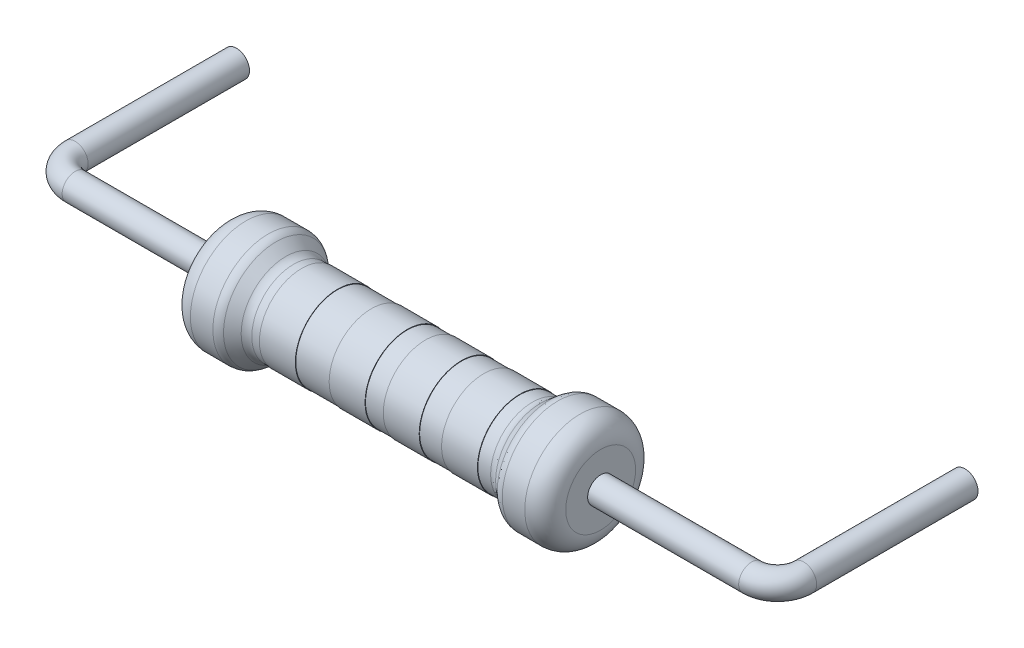
ISO-10303-21;
HEADER;
FILE_DESCRIPTION(('STEP AP214'),'2;1');
FILE_NAME('part.step','',(''),(''),'','','');
FILE_SCHEMA(('AUTOMOTIVE_DESIGN { 1 0 10303 214 1 1 1 1 }'));
ENDSEC;
DATA;
#1=APPLICATION_CONTEXT('core data for automotive mechanical design processes');
#2=APPLICATION_PROTOCOL_DEFINITION('international standard','automotive_design',2000,#1);
#3=PRODUCT_CONTEXT('',#1,'mechanical');
#4=PRODUCT('Part','Part','',(#3));
#5=PRODUCT_RELATED_PRODUCT_CATEGORY('part','',(#4));
#6=PRODUCT_DEFINITION_FORMATION('','',#4);
#7=PRODUCT_DEFINITION_CONTEXT('part definition',#1,'design');
#8=PRODUCT_DEFINITION('design','',#6,#7);
#9=PRODUCT_DEFINITION_SHAPE('','',#8);
#10=(LENGTH_UNIT() NAMED_UNIT(*) SI_UNIT(.MILLI.,.METRE.));
#11=(NAMED_UNIT(*) PLANE_ANGLE_UNIT() SI_UNIT($,.RADIAN.));
#12=(NAMED_UNIT(*) SI_UNIT($,.STERADIAN.) SOLID_ANGLE_UNIT());
#13=UNCERTAINTY_MEASURE_WITH_UNIT(LENGTH_MEASURE(1.E-05),#10,'distance_accuracy_value','');
#14=(GEOMETRIC_REPRESENTATION_CONTEXT(3) GLOBAL_UNCERTAINTY_ASSIGNED_CONTEXT((#13)) GLOBAL_UNIT_ASSIGNED_CONTEXT((#10,
#11,#12)) REPRESENTATION_CONTEXT('',''));
#15=CARTESIAN_POINT('',(0.,0.,0.));
#16=DIRECTION('',(0.,0.,1.));
#17=DIRECTION('',(1.,0.,0.));
#18=AXIS2_PLACEMENT_3D('',#15,#16,#17);
#19=CARTESIAN_POINT('',(9.71070660743841,33.0962,0.7747));
#20=DIRECTION('',(0.,1.,0.));
#21=DIRECTION('',(0.,0.,1.));
#22=AXIS2_PLACEMENT_3D('',#19,#20,#21);
#23=TOROIDAL_SURFACE('',#22,0.635,0.3175);
#24=CARTESIAN_POINT('',(9.07570660743841,33.0962,0.7747));
#25=DIRECTION('',(0.,0.,-1.));
#26=DIRECTION('',(-1.,0.,0.));
#27=AXIS2_PLACEMENT_3D('',#24,#25,#26);
#28=CIRCLE('',#27,0.3175);
#29=CARTESIAN_POINT('',(9.39320660743841,33.0962,0.7747));
#30=VERTEX_POINT('',#29);
#31=EDGE_CURVE('E40',#30,#30,#28,.T.);
#32=ORIENTED_EDGE('',*,*,#31,.F.);
#33=EDGE_LOOP('',(#32));
#34=FACE_BOUND('',#33,.T.);
#35=CARTESIAN_POINT('',(9.71070660743841,33.0962,1.4097));
#36=DIRECTION('',(-1.,0.,0.));
#37=DIRECTION('',(0.,0.,1.));
#38=AXIS2_PLACEMENT_3D('',#35,#36,#37);
#39=CIRCLE('',#38,0.3175);
#40=CARTESIAN_POINT('',(9.71070660743841,33.0962,1.0922));
#41=VERTEX_POINT('',#40);
#42=EDGE_CURVE('E11',#41,#41,#39,.T.);
#43=ORIENTED_EDGE('',*,*,#42,.T.);
#44=EDGE_LOOP('',(#43));
#45=FACE_BOUND('',#44,.T.);
#46=ADVANCED_FACE('F16',(#34,#45),#23,.T.);
#47=CARTESIAN_POINT('',(26.2207066074384,33.0962,0.7747));
#48=DIRECTION('',(0.,-1.,0.));
#49=DIRECTION('',(0.,0.,-1.));
#50=AXIS2_PLACEMENT_3D('',#47,#48,#49);
#51=TOROIDAL_SURFACE('',#50,0.635,0.3175);
#52=CARTESIAN_POINT('',(26.8557066074384,33.0962,0.7747));
#53=DIRECTION('',(0.,0.,-1.));
#54=DIRECTION('',(-1.,0.,0.));
#55=AXIS2_PLACEMENT_3D('',#52,#53,#54);
#56=CIRCLE('',#55,0.3175);
#57=CARTESIAN_POINT('',(26.5382066074384,33.0962,0.7747));
#58=VERTEX_POINT('',#57);
#59=EDGE_CURVE('E208',#58,#58,#56,.T.);
#60=ORIENTED_EDGE('',*,*,#59,.F.);
#61=EDGE_LOOP('',(#60));
#62=FACE_BOUND('',#61,.T.);
#63=CARTESIAN_POINT('',(26.2207066074384,33.0962,1.4097));
#64=DIRECTION('',(1.,0.,0.));
#65=DIRECTION('',(0.,0.,-1.));
#66=AXIS2_PLACEMENT_3D('',#63,#64,#65);
#67=CIRCLE('',#66,0.3175);
#68=CARTESIAN_POINT('',(26.2207066074384,33.0962,1.0922));
#69=VERTEX_POINT('',#68);
#70=EDGE_CURVE('E27',#69,#69,#67,.T.);
#71=ORIENTED_EDGE('',*,*,#70,.T.);
#72=EDGE_LOOP('',(#71));
#73=FACE_BOUND('',#72,.T.);
#74=ADVANCED_FACE('F265',(#62,#73),#51,.T.);
#75=CARTESIAN_POINT('',(26.8557066074384,33.0962,0.0127000000000011));
#76=DIRECTION('',(0.,0.,-1.));
#77=DIRECTION('',(-1.,0.,0.));
#78=AXIS2_PLACEMENT_3D('',#75,#76,#77);
#79=CYLINDRICAL_SURFACE('',#78,0.3175);
#80=ORIENTED_EDGE('',*,*,#59,.T.);
#81=EDGE_LOOP('',(#80));
#82=FACE_BOUND('',#81,.T.);
#83=CARTESIAN_POINT('',(26.8557066074384,33.0962,-3.1623));
#84=DIRECTION('',(0.,0.,1.));
#85=DIRECTION('',(-1.,0.,0.));
#86=AXIS2_PLACEMENT_3D('',#83,#84,#85);
#87=CIRCLE('',#86,0.3175);
#88=CARTESIAN_POINT('',(26.5382066074384,33.0962,-3.1623));
#89=VERTEX_POINT('',#88);
#90=EDGE_CURVE('E212',#89,#89,#87,.T.);
#91=ORIENTED_EDGE('',*,*,#90,.T.);
#92=EDGE_LOOP('',(#91));
#93=FACE_BOUND('',#92,.T.);
#94=ADVANCED_FACE('F271',(#82,#93),#79,.T.);
#95=CARTESIAN_POINT('',(9.07570660743841,33.0962,0.0127000000000011));
#96=DIRECTION('',(0.,0.,-1.));
#97=DIRECTION('',(-1.,0.,0.));
#98=AXIS2_PLACEMENT_3D('',#95,#96,#97);
#99=CYLINDRICAL_SURFACE('',#98,0.3175);
#100=ORIENTED_EDGE('',*,*,#31,.T.);
#101=EDGE_LOOP('',(#100));
#102=FACE_BOUND('',#101,.T.);
#103=CARTESIAN_POINT('',(9.07570660743841,33.0962,-3.1623));
#104=DIRECTION('',(0.,0.,1.));
#105=DIRECTION('',(-1.,0.,0.));
#106=AXIS2_PLACEMENT_3D('',#103,#104,#105);
#107=CIRCLE('',#106,0.3175);
#108=CARTESIAN_POINT('',(8.75820660743841,33.0962,-3.1623));
#109=VERTEX_POINT('',#108);
#110=EDGE_CURVE('E199',#109,#109,#107,.T.);
#111=ORIENTED_EDGE('',*,*,#110,.T.);
#112=EDGE_LOOP('',(#111));
#113=FACE_BOUND('',#112,.T.);
#114=ADVANCED_FACE('F300',(#102,#113),#99,.T.);
#115=CARTESIAN_POINT('',(13.8757066074384,33.0962,1.4097));
#116=DIRECTION('',(-1.,0.,0.));
#117=DIRECTION('',(0.,0.,1.));
#118=AXIS2_PLACEMENT_3D('',#115,#116,#117);
#119=TOROIDAL_SURFACE('',#118,0.85255,0.5);
#120=CARTESIAN_POINT('',(13.8757066074384,33.0962,1.4097));
#121=DIRECTION('',(-1.,0.,0.));
#122=DIRECTION('',(0.,0.,1.));
#123=AXIS2_PLACEMENT_3D('',#120,#121,#122);
#124=CIRCLE('',#123,1.35255);
#125=CARTESIAN_POINT('',(13.8757066074384,33.0962,0.0571500000000012));
#126=VERTEX_POINT('',#125);
#127=EDGE_CURVE('E203',#126,#126,#124,.T.);
#128=ORIENTED_EDGE('',*,*,#127,.T.);
#129=EDGE_LOOP('',(#128));
#130=FACE_BOUND('',#129,.T.);
#131=CARTESIAN_POINT('',(13.3757066074384,33.0962,1.4097));
#132=DIRECTION('',(-1.,0.,0.));
#133=DIRECTION('',(0.,0.,1.));
#134=AXIS2_PLACEMENT_3D('',#131,#132,#133);
#135=CIRCLE('',#134,0.85255);
#136=CARTESIAN_POINT('',(13.3757066074384,33.0962,2.26225));
#137=VERTEX_POINT('',#136);
#138=EDGE_CURVE('E162',#137,#137,#135,.T.);
#139=ORIENTED_EDGE('',*,*,#138,.F.);
#140=EDGE_LOOP('',(#139));
#141=FACE_BOUND('',#140,.T.);
#142=ADVANCED_FACE('F348',(#130,#141),#119,.T.);
#143=CARTESIAN_POINT('',(14.1497983015064,33.0962,1.4097));
#144=DIRECTION('',(-1.,0.,0.));
#145=DIRECTION('',(0.,0.,1.));
#146=AXIS2_PLACEMENT_3D('',#143,#144,#145);
#147=CYLINDRICAL_SURFACE('',#146,1.35255);
#148=CARTESIAN_POINT('',(14.4238899955734,33.0962,1.4097));
#149=DIRECTION('',(-1.,0.,0.));
#150=DIRECTION('',(0.,0.,1.));
#151=AXIS2_PLACEMENT_3D('',#148,#149,#150);
#152=CIRCLE('',#151,1.35255);
#153=CARTESIAN_POINT('',(14.4238899955734,33.0962,0.0571500000000011));
#154=VERTEX_POINT('',#153);
#155=EDGE_CURVE('E171',#154,#154,#152,.T.);
#156=ORIENTED_EDGE('',*,*,#155,.T.);
#157=EDGE_LOOP('',(#156));
#158=FACE_BOUND('',#157,.T.);
#159=ORIENTED_EDGE('',*,*,#127,.F.);
#160=EDGE_LOOP('',(#159));
#161=FACE_BOUND('',#160,.T.);
#162=ADVANCED_FACE('F276',(#158,#161),#147,.T.);
#163=CARTESIAN_POINT('',(14.4238899955734,33.0962,1.4097));
#164=DIRECTION('',(-1.,0.,0.));
#165=DIRECTION('',(0.,0.,1.));
#166=AXIS2_PLACEMENT_3D('',#163,#164,#165);
#167=TOROIDAL_SURFACE('',#166,1.05255,0.3);
#168=CARTESIAN_POINT('',(14.6152283747944,33.0962,1.4097));
#169=DIRECTION('',(-1.,0.,0.));
#170=DIRECTION('',(0.,0.,1.));
#171=AXIS2_PLACEMENT_3D('',#168,#169,#170);
#172=CIRCLE('',#171,1.283611949782);
#173=CARTESIAN_POINT('',(14.6152283747944,33.0962,0.12608805037443));
#174=VERTEX_POINT('',#173);
#175=EDGE_CURVE('E167',#174,#174,#172,.T.);
#176=ORIENTED_EDGE('',*,*,#175,.T.);
#177=EDGE_LOOP('',(#176));
#178=FACE_BOUND('',#177,.T.);
#179=ORIENTED_EDGE('',*,*,#155,.F.);
#180=EDGE_LOOP('',(#179));
#181=FACE_BOUND('',#180,.T.);
#182=ADVANCED_FACE('F302',(#178,#181),#167,.T.);
#183=CARTESIAN_POINT('',(14.7328640249674,33.0962,1.4097));
#184=DIRECTION('',(-1.,0.,0.));
#185=DIRECTION('',(0.,0.,1.));
#186=AXIS2_PLACEMENT_3D('',#183,#184,#185);
#187=CONICAL_SURFACE('',#186,1.1861999152,0.691631466793246);
#188=CARTESIAN_POINT('',(14.8504996751404,33.0962,1.4097));
#189=DIRECTION('',(-1.,0.,0.));
#190=DIRECTION('',(0.,0.,1.));
#191=AXIS2_PLACEMENT_3D('',#188,#189,#190);
#192=CIRCLE('',#191,1.088787880619);
#193=CARTESIAN_POINT('',(14.8504996751404,33.0962,0.320912119381024));
#194=VERTEX_POINT('',#193);
#195=EDGE_CURVE('E172',#194,#194,#192,.T.);
#196=ORIENTED_EDGE('',*,*,#195,.T.);
#197=EDGE_LOOP('',(#196));
#198=FACE_BOUND('',#197,.T.);
#199=ORIENTED_EDGE('',*,*,#175,.F.);
#200=EDGE_LOOP('',(#199));
#201=FACE_BOUND('',#200,.T.);
#202=ADVANCED_FACE('F305',(#198,#201),#187,.T.);
#203=CARTESIAN_POINT('',(15.0418380543614,33.0962,1.4097));
#204=DIRECTION('',(-1.,0.,0.));
#205=DIRECTION('',(0.,0.,1.));
#206=AXIS2_PLACEMENT_3D('',#203,#204,#205);
#207=TOROIDAL_SURFACE('',#206,1.319849830401,0.3);
#208=ORIENTED_EDGE('',*,*,#195,.F.);
#209=EDGE_LOOP('',(#208));
#210=FACE_BOUND('',#209,.T.);
#211=CARTESIAN_POINT('',(15.0418380543614,33.0962,1.4097));
#212=DIRECTION('',(-1.,0.,0.));
#213=DIRECTION('',(0.,0.,1.));
#214=AXIS2_PLACEMENT_3D('',#211,#212,#213);
#215=CIRCLE('',#214,1.019849830401);
#216=CARTESIAN_POINT('',(15.0418380543614,33.0962,2.429549830401));
#217=VERTEX_POINT('',#216);
#218=EDGE_CURVE('E225',#217,#217,#215,.T.);
#219=ORIENTED_EDGE('',*,*,#218,.T.);
#220=EDGE_LOOP('',(#219));
#221=FACE_BOUND('',#220,.T.);
#222=ADVANCED_FACE('F342',(#210,#221),#207,.F.);
#223=CARTESIAN_POINT('',(17.9557066074384,33.0962,1.4097));
#224=DIRECTION('',(-1.,0.,0.));
#225=DIRECTION('',(0.,0.,1.));
#226=AXIS2_PLACEMENT_3D('',#223,#224,#225);
#227=CYLINDRICAL_SURFACE('',#226,1.019849830401);
#228=CARTESIAN_POINT('',(15.2382627119724,33.0962,1.4097));
#229=DIRECTION('',(-1.,0.,0.));
#230=DIRECTION('',(0.,0.,1.));
#231=AXIS2_PLACEMENT_3D('',#228,#229,#230);
#232=CIRCLE('',#231,1.019849830401);
#233=CARTESIAN_POINT('',(15.2382627119724,33.0962,0.389850169599001));
#234=VERTEX_POINT('',#233);
#235=EDGE_CURVE('E192',#234,#234,#232,.T.);
#236=ORIENTED_EDGE('',*,*,#235,.T.);
#237=EDGE_LOOP('',(#236));
#238=FACE_BOUND('',#237,.T.);
#239=ORIENTED_EDGE('',*,*,#218,.F.);
#240=EDGE_LOOP('',(#239));
#241=FACE_BOUND('',#240,.T.);
#242=ADVANCED_FACE('F323',(#238,#241),#227,.T.);
#243=CARTESIAN_POINT('',(20.8695751605154,33.0962,1.4097));
#244=DIRECTION('',(-1.,0.,0.));
#245=DIRECTION('',(0.,0.,1.));
#246=AXIS2_PLACEMENT_3D('',#243,#244,#245);
#247=TOROIDAL_SURFACE('',#246,1.319849830401,0.3);
#248=CARTESIAN_POINT('',(20.8695751605154,33.0962,1.4097));
#249=DIRECTION('',(-1.,0.,0.));
#250=DIRECTION('',(0.,0.,1.));
#251=AXIS2_PLACEMENT_3D('',#248,#249,#250);
#252=CIRCLE('',#251,1.019849830401);
#253=CARTESIAN_POINT('',(20.8695751605154,33.0962,2.429549830401));
#254=VERTEX_POINT('',#253);
#255=EDGE_CURVE('E187',#254,#254,#252,.T.);
#256=ORIENTED_EDGE('',*,*,#255,.F.);
#257=EDGE_LOOP('',(#256));
#258=FACE_BOUND('',#257,.T.);
#259=CARTESIAN_POINT('',(21.0609135397364,33.0962,1.4097));
#260=DIRECTION('',(-1.,0.,0.));
#261=DIRECTION('',(0.,0.,1.));
#262=AXIS2_PLACEMENT_3D('',#259,#260,#261);
#263=CIRCLE('',#262,1.088787880619);
#264=CARTESIAN_POINT('',(21.0609135397364,33.0962,2.498487880619));
#265=VERTEX_POINT('',#264);
#266=EDGE_CURVE('E188',#265,#265,#263,.T.);
#267=ORIENTED_EDGE('',*,*,#266,.T.);
#268=EDGE_LOOP('',(#267));
#269=FACE_BOUND('',#268,.T.);
#270=ADVANCED_FACE('F319',(#258,#269),#247,.F.);
#271=CARTESIAN_POINT('',(21.1785491899094,33.0962,1.4097));
#272=DIRECTION('',(1.,0.,0.));
#273=DIRECTION('',(0.,0.,1.));
#274=AXIS2_PLACEMENT_3D('',#271,#272,#273);
#275=CONICAL_SURFACE('',#274,1.1861999152,0.691631466793246);
#276=ORIENTED_EDGE('',*,*,#266,.F.);
#277=EDGE_LOOP('',(#276));
#278=FACE_BOUND('',#277,.T.);
#279=CARTESIAN_POINT('',(21.2961848400824,33.0962,1.4097));
#280=DIRECTION('',(-1.,0.,0.));
#281=DIRECTION('',(0.,0.,1.));
#282=AXIS2_PLACEMENT_3D('',#279,#280,#281);
#283=CIRCLE('',#282,1.283611949782);
#284=CARTESIAN_POINT('',(21.2961848400824,33.0962,2.693311949782));
#285=VERTEX_POINT('',#284);
#286=EDGE_CURVE('E193',#285,#285,#283,.T.);
#287=ORIENTED_EDGE('',*,*,#286,.T.);
#288=EDGE_LOOP('',(#287));
#289=FACE_BOUND('',#288,.T.);
#290=ADVANCED_FACE('F322',(#278,#289),#275,.T.);
#291=CARTESIAN_POINT('',(21.4875232193034,33.0962,1.4097));
#292=DIRECTION('',(-1.,0.,0.));
#293=DIRECTION('',(0.,0.,1.));
#294=AXIS2_PLACEMENT_3D('',#291,#292,#293);
#295=TOROIDAL_SURFACE('',#294,1.05255,0.3);
#296=CARTESIAN_POINT('',(21.4875232193034,33.0962,1.4097));
#297=DIRECTION('',(-1.,0.,0.));
#298=DIRECTION('',(0.,0.,1.));
#299=AXIS2_PLACEMENT_3D('',#296,#297,#298);
#300=CIRCLE('',#299,1.35255);
#301=CARTESIAN_POINT('',(21.4875232193034,33.0962,0.0571500000000012));
#302=VERTEX_POINT('',#301);
#303=EDGE_CURVE('E177',#302,#302,#300,.T.);
#304=ORIENTED_EDGE('',*,*,#303,.T.);
#305=EDGE_LOOP('',(#304));
#306=FACE_BOUND('',#305,.T.);
#307=ORIENTED_EDGE('',*,*,#286,.F.);
#308=EDGE_LOOP('',(#307));
#309=FACE_BOUND('',#308,.T.);
#310=ADVANCED_FACE('F311',(#306,#309),#295,.T.);
#311=CARTESIAN_POINT('',(21.7616149133704,33.0962,1.4097));
#312=DIRECTION('',(-1.,0.,0.));
#313=DIRECTION('',(0.,0.,1.));
#314=AXIS2_PLACEMENT_3D('',#311,#312,#313);
#315=CYLINDRICAL_SURFACE('',#314,1.35255);
#316=CARTESIAN_POINT('',(22.0357066074384,33.0962,1.4097));
#317=DIRECTION('',(-1.,0.,0.));
#318=DIRECTION('',(0.,0.,1.));
#319=AXIS2_PLACEMENT_3D('',#316,#317,#318);
#320=CIRCLE('',#319,1.35255);
#321=CARTESIAN_POINT('',(22.0357066074384,33.0962,0.0571500000000011));
#322=VERTEX_POINT('',#321);
#323=EDGE_CURVE('E173',#322,#322,#320,.T.);
#324=ORIENTED_EDGE('',*,*,#323,.T.);
#325=EDGE_LOOP('',(#324));
#326=FACE_BOUND('',#325,.T.);
#327=ORIENTED_EDGE('',*,*,#303,.F.);
#328=EDGE_LOOP('',(#327));
#329=FACE_BOUND('',#328,.T.);
#330=ADVANCED_FACE('F307',(#326,#329),#315,.T.);
#331=CARTESIAN_POINT('',(22.0357066074384,33.0962,1.4097));
#332=DIRECTION('',(-1.,0.,0.));
#333=DIRECTION('',(0.,0.,1.));
#334=AXIS2_PLACEMENT_3D('',#331,#332,#333);
#335=TOROIDAL_SURFACE('',#334,0.85255,0.5);
#336=CARTESIAN_POINT('',(22.5357066074384,33.0962,1.4097));
#337=DIRECTION('',(-1.,0.,0.));
#338=DIRECTION('',(0.,0.,1.));
#339=AXIS2_PLACEMENT_3D('',#336,#337,#338);
#340=CIRCLE('',#339,0.85255);
#341=CARTESIAN_POINT('',(22.5357066074384,33.0962,0.55715));
#342=VERTEX_POINT('',#341);
#343=EDGE_CURVE('E178',#342,#342,#340,.T.);
#344=ORIENTED_EDGE('',*,*,#343,.T.);
#345=EDGE_LOOP('',(#344));
#346=FACE_BOUND('',#345,.T.);
#347=ORIENTED_EDGE('',*,*,#323,.F.);
#348=EDGE_LOOP('',(#347));
#349=FACE_BOUND('',#348,.T.);
#350=ADVANCED_FACE('F310',(#346,#349),#335,.T.);
#351=CARTESIAN_POINT('',(9.71070660743841,33.0962,1.4097));
#352=DIRECTION('',(1.,0.,0.));
#353=DIRECTION('',(0.,0.,1.));
#354=AXIS2_PLACEMENT_3D('',#351,#352,#353);
#355=CYLINDRICAL_SURFACE('',#354,0.3175);
#356=ORIENTED_EDGE('',*,*,#42,.F.);
#357=EDGE_LOOP('',(#356));
#358=FACE_BOUND('',#357,.T.);
#359=CARTESIAN_POINT('',(13.3757066074384,33.0962,1.4097));
#360=DIRECTION('',(1.,0.,0.));
#361=DIRECTION('',(0.,0.,1.));
#362=AXIS2_PLACEMENT_3D('',#359,#360,#361);
#363=CIRCLE('',#362,0.3175);
#364=CARTESIAN_POINT('',(13.3757066074384,33.0962,1.7272));
#365=VERTEX_POINT('',#364);
#366=EDGE_CURVE('E226',#365,#365,#363,.T.);
#367=ORIENTED_EDGE('',*,*,#366,.F.);
#368=EDGE_LOOP('',(#367));
#369=FACE_BOUND('',#368,.T.);
#370=ADVANCED_FACE('F329',(#358,#369),#355,.T.);
#371=CARTESIAN_POINT('',(26.2207066074384,33.0962,1.4097));
#372=DIRECTION('',(-1.,0.,0.));
#373=DIRECTION('',(0.,0.,-1.));
#374=AXIS2_PLACEMENT_3D('',#371,#372,#373);
#375=CYLINDRICAL_SURFACE('',#374,0.3175);
#376=ORIENTED_EDGE('',*,*,#70,.F.);
#377=EDGE_LOOP('',(#376));
#378=FACE_BOUND('',#377,.T.);
#379=CARTESIAN_POINT('',(22.5357066074384,33.0962,1.4097));
#380=DIRECTION('',(-1.,0.,0.));
#381=DIRECTION('',(0.,0.,-1.));
#382=AXIS2_PLACEMENT_3D('',#379,#380,#381);
#383=CIRCLE('',#382,0.3175);
#384=CARTESIAN_POINT('',(22.5357066074384,33.0962,1.0922));
#385=VERTEX_POINT('',#384);
#386=EDGE_CURVE('E230',#385,#385,#383,.T.);
#387=ORIENTED_EDGE('',*,*,#386,.F.);
#388=EDGE_LOOP('',(#387));
#389=FACE_BOUND('',#388,.T.);
#390=ADVANCED_FACE('F327',(#378,#389),#375,.T.);
#391=CARTESIAN_POINT('',(17.9557066074384,33.0962,1.4097));
#392=DIRECTION('',(-1.,0.,0.));
#393=DIRECTION('',(0.,0.,1.));
#394=AXIS2_PLACEMENT_3D('',#391,#392,#393);
#395=CYLINDRICAL_SURFACE('',#394,1.019849830401);
#396=ORIENTED_EDGE('',*,*,#255,.T.);
#397=EDGE_LOOP('',(#396));
#398=FACE_BOUND('',#397,.T.);
#399=CARTESIAN_POINT('',(20.5595627119724,33.0962,1.4097));
#400=DIRECTION('',(1.,0.,0.));
#401=DIRECTION('',(0.,0.,1.));
#402=AXIS2_PLACEMENT_3D('',#399,#400,#401);
#403=CIRCLE('',#402,1.019849830401);
#404=CARTESIAN_POINT('',(20.5595627119724,33.0962,2.429549830401));
#405=VERTEX_POINT('',#404);
#406=EDGE_CURVE('E216',#405,#405,#403,.T.);
#407=ORIENTED_EDGE('',*,*,#406,.T.);
#408=EDGE_LOOP('',(#407));
#409=FACE_BOUND('',#408,.T.);
#410=ADVANCED_FACE('F292',(#398,#409),#395,.T.);
#411=CARTESIAN_POINT('',(17.9557066074384,33.0962,1.4097));
#412=DIRECTION('',(-1.,0.,0.));
#413=DIRECTION('',(0.,0.,1.));
#414=AXIS2_PLACEMENT_3D('',#411,#412,#413);
#415=CYLINDRICAL_SURFACE('',#414,1.019849830401);
#416=CARTESIAN_POINT('',(19.6832627119724,33.0962,1.4097));
#417=DIRECTION('',(-1.,0.,0.));
#418=DIRECTION('',(0.,0.,1.));
#419=AXIS2_PLACEMENT_3D('',#416,#417,#418);
#420=CIRCLE('',#419,1.019849830401);
#421=CARTESIAN_POINT('',(19.6832627119724,33.0962,0.389850169599001));
#422=VERTEX_POINT('',#421);
#423=EDGE_CURVE('E198',#422,#422,#420,.T.);
#424=ORIENTED_EDGE('',*,*,#423,.T.);
#425=EDGE_LOOP('',(#424));
#426=FACE_BOUND('',#425,.T.);
#427=CARTESIAN_POINT('',(19.1371627119724,33.0962,1.4097));
#428=DIRECTION('',(1.,0.,0.));
#429=DIRECTION('',(0.,0.,1.));
#430=AXIS2_PLACEMENT_3D('',#427,#428,#429);
#431=CIRCLE('',#430,1.019849830401);
#432=CARTESIAN_POINT('',(19.1371627119724,33.0962,2.429549830401));
#433=VERTEX_POINT('',#432);
#434=EDGE_CURVE('E194',#433,#433,#431,.T.);
#435=ORIENTED_EDGE('',*,*,#434,.T.);
#436=EDGE_LOOP('',(#435));
#437=FACE_BOUND('',#436,.T.);
#438=ADVANCED_FACE('F289',(#426,#437),#415,.T.);
#439=CARTESIAN_POINT('',(17.9557066074384,33.0962,1.4097));
#440=DIRECTION('',(-1.,0.,0.));
#441=DIRECTION('',(0.,0.,1.));
#442=AXIS2_PLACEMENT_3D('',#439,#440,#441);
#443=CYLINDRICAL_SURFACE('',#442,1.019849830401);
#444=CARTESIAN_POINT('',(18.2608627119724,33.0962,1.4097));
#445=DIRECTION('',(-1.,0.,0.));
#446=DIRECTION('',(0.,0.,1.));
#447=AXIS2_PLACEMENT_3D('',#444,#445,#446);
#448=CIRCLE('',#447,1.019849830401);
#449=CARTESIAN_POINT('',(18.2608627119724,33.0962,0.389850169599001));
#450=VERTEX_POINT('',#449);
#451=EDGE_CURVE('E183',#450,#450,#448,.T.);
#452=ORIENTED_EDGE('',*,*,#451,.T.);
#453=EDGE_LOOP('',(#452));
#454=FACE_BOUND('',#453,.T.);
#455=CARTESIAN_POINT('',(17.8163627119724,33.0962,1.4097));
#456=DIRECTION('',(1.,0.,0.));
#457=DIRECTION('',(0.,0.,1.));
#458=AXIS2_PLACEMENT_3D('',#455,#456,#457);
#459=CIRCLE('',#458,1.019849830401);
#460=CARTESIAN_POINT('',(17.8163627119724,33.0962,2.429549830401));
#461=VERTEX_POINT('',#460);
#462=EDGE_CURVE('E179',#461,#461,#459,.T.);
#463=ORIENTED_EDGE('',*,*,#462,.T.);
#464=EDGE_LOOP('',(#463));
#465=FACE_BOUND('',#464,.T.);
#466=ADVANCED_FACE('F247',(#454,#465),#443,.T.);
#467=CARTESIAN_POINT('',(17.9557066074384,33.0962,1.4097));
#468=DIRECTION('',(-1.,0.,0.));
#469=DIRECTION('',(0.,0.,1.));
#470=AXIS2_PLACEMENT_3D('',#467,#468,#469);
#471=CYLINDRICAL_SURFACE('',#470,1.019849830401);
#472=CARTESIAN_POINT('',(16.9400627119724,33.0962,1.4097));
#473=DIRECTION('',(-1.,0.,0.));
#474=DIRECTION('',(0.,0.,1.));
#475=AXIS2_PLACEMENT_3D('',#472,#473,#474);
#476=CIRCLE('',#475,1.019849830401);
#477=CARTESIAN_POINT('',(16.9400627119724,33.0962,0.389850169599001));
#478=VERTEX_POINT('',#477);
#479=EDGE_CURVE('E166',#478,#478,#476,.T.);
#480=ORIENTED_EDGE('',*,*,#479,.T.);
#481=EDGE_LOOP('',(#480));
#482=FACE_BOUND('',#481,.T.);
#483=CARTESIAN_POINT('',(16.1145627119724,33.0962,1.4097));
#484=DIRECTION('',(1.,0.,0.));
#485=DIRECTION('',(0.,0.,1.));
#486=AXIS2_PLACEMENT_3D('',#483,#484,#485);
#487=CIRCLE('',#486,1.019849830401);
#488=CARTESIAN_POINT('',(16.1145627119724,33.0962,2.429549830401));
#489=VERTEX_POINT('',#488);
#490=EDGE_CURVE('E423',#489,#489,#487,.T.);
#491=ORIENTED_EDGE('',*,*,#490,.T.);
#492=EDGE_LOOP('',(#491));
#493=FACE_BOUND('',#492,.T.);
#494=ADVANCED_FACE('F278',(#482,#493),#471,.T.);
#495=CARTESIAN_POINT('',(15.6764127119724,33.0962,1.4097));
#496=DIRECTION('',(-1.,0.,0.));
#497=DIRECTION('',(0.,0.,1.));
#498=AXIS2_PLACEMENT_3D('',#495,#496,#497);
#499=CYLINDRICAL_SURFACE('',#498,1.030517137019);
#500=CARTESIAN_POINT('',(16.1145627119724,33.0962,1.4097));
#501=DIRECTION('',(-1.,0.,0.));
#502=DIRECTION('',(0.,0.,1.));
#503=AXIS2_PLACEMENT_3D('',#500,#501,#502);
#504=CIRCLE('',#503,1.030517137019);
#505=CARTESIAN_POINT('',(16.1145627119724,33.0962,0.379182862981001));
#506=VERTEX_POINT('',#505);
#507=EDGE_CURVE('E428',#506,#506,#504,.T.);
#508=ORIENTED_EDGE('',*,*,#507,.T.);
#509=EDGE_LOOP('',(#508));
#510=FACE_BOUND('',#509,.T.);
#511=CARTESIAN_POINT('',(15.2382627119724,33.0962,1.4097));
#512=DIRECTION('',(-1.,0.,0.));
#513=DIRECTION('',(0.,0.,1.));
#514=AXIS2_PLACEMENT_3D('',#511,#512,#513);
#515=CIRCLE('',#514,1.030517137019);
#516=CARTESIAN_POINT('',(15.2382627119724,33.0962,2.440217137019));
#517=VERTEX_POINT('',#516);
#518=EDGE_CURVE('E151',#517,#517,#515,.T.);
#519=ORIENTED_EDGE('',*,*,#518,.F.);
#520=EDGE_LOOP('',(#519));
#521=FACE_BOUND('',#520,.T.);
#522=ADVANCED_FACE('F281',(#510,#521),#499,.T.);
#523=CARTESIAN_POINT('',(17.3782127119724,33.0962,1.4097));
#524=DIRECTION('',(-1.,0.,0.));
#525=DIRECTION('',(0.,0.,1.));
#526=AXIS2_PLACEMENT_3D('',#523,#524,#525);
#527=CYLINDRICAL_SURFACE('',#526,1.030517137019);
#528=CARTESIAN_POINT('',(17.8163627119724,33.0962,1.4097));
#529=DIRECTION('',(-1.,0.,0.));
#530=DIRECTION('',(0.,0.,1.));
#531=AXIS2_PLACEMENT_3D('',#528,#529,#530);
#532=CIRCLE('',#531,1.030517137019);
#533=CARTESIAN_POINT('',(17.8163627119724,33.0962,0.379182862981001));
#534=VERTEX_POINT('',#533);
#535=EDGE_CURVE('E20',#534,#534,#532,.T.);
#536=ORIENTED_EDGE('',*,*,#535,.T.);
#537=EDGE_LOOP('',(#536));
#538=FACE_BOUND('',#537,.T.);
#539=CARTESIAN_POINT('',(16.9400627119724,33.0962,1.4097));
#540=DIRECTION('',(-1.,0.,0.));
#541=DIRECTION('',(0.,0.,1.));
#542=AXIS2_PLACEMENT_3D('',#539,#540,#541);
#543=CIRCLE('',#542,1.030517137019);
#544=CARTESIAN_POINT('',(16.9400627119724,33.0962,2.440217137019));
#545=VERTEX_POINT('',#544);
#546=EDGE_CURVE('E146',#545,#545,#543,.T.);
#547=ORIENTED_EDGE('',*,*,#546,.F.);
#548=EDGE_LOOP('',(#547));
#549=FACE_BOUND('',#548,.T.);
#550=ADVANCED_FACE('F147',(#538,#549),#527,.T.);
#551=CARTESIAN_POINT('',(18.6990127119724,33.0962,1.4097));
#552=DIRECTION('',(-1.,0.,0.));
#553=DIRECTION('',(0.,0.,1.));
#554=AXIS2_PLACEMENT_3D('',#551,#552,#553);
#555=CYLINDRICAL_SURFACE('',#554,1.030517137019);
#556=CARTESIAN_POINT('',(19.1371627119724,33.0962,1.4097));
#557=DIRECTION('',(-1.,0.,0.));
#558=DIRECTION('',(0.,0.,1.));
#559=AXIS2_PLACEMENT_3D('',#556,#557,#558);
#560=CIRCLE('',#559,1.030517137019);
#561=CARTESIAN_POINT('',(19.1371627119724,33.0962,0.379182862981001));
#562=VERTEX_POINT('',#561);
#563=EDGE_CURVE('E901',#562,#562,#560,.T.);
#564=ORIENTED_EDGE('',*,*,#563,.T.);
#565=EDGE_LOOP('',(#564));
#566=FACE_BOUND('',#565,.T.);
#567=CARTESIAN_POINT('',(18.2608627119724,33.0962,1.4097));
#568=DIRECTION('',(-1.,0.,0.));
#569=DIRECTION('',(0.,0.,1.));
#570=AXIS2_PLACEMENT_3D('',#567,#568,#569);
#571=CIRCLE('',#570,1.030517137019);
#572=CARTESIAN_POINT('',(18.2608627119724,33.0962,2.440217137019));
#573=VERTEX_POINT('',#572);
#574=EDGE_CURVE('E150',#573,#573,#571,.T.);
#575=ORIENTED_EDGE('',*,*,#574,.F.);
#576=EDGE_LOOP('',(#575));
#577=FACE_BOUND('',#576,.T.);
#578=ADVANCED_FACE('F296',(#566,#577),#555,.T.);
#579=CARTESIAN_POINT('',(20.1214127119724,33.0962,1.4097));
#580=DIRECTION('',(-1.,0.,0.));
#581=DIRECTION('',(0.,0.,1.));
#582=AXIS2_PLACEMENT_3D('',#579,#580,#581);
#583=CYLINDRICAL_SURFACE('',#582,1.030517137019);
#584=CARTESIAN_POINT('',(20.5595627119724,33.0962,1.4097));
#585=DIRECTION('',(-1.,0.,0.));
#586=DIRECTION('',(0.,0.,1.));
#587=AXIS2_PLACEMENT_3D('',#584,#585,#586);
#588=CIRCLE('',#587,1.030517137019);
#589=CARTESIAN_POINT('',(20.5595627119724,33.0962,0.379182862981001));
#590=VERTEX_POINT('',#589);
#591=EDGE_CURVE('E206',#590,#590,#588,.T.);
#592=ORIENTED_EDGE('',*,*,#591,.T.);
#593=EDGE_LOOP('',(#592));
#594=FACE_BOUND('',#593,.T.);
#595=CARTESIAN_POINT('',(19.6832627119724,33.0962,1.4097));
#596=DIRECTION('',(-1.,0.,0.));
#597=DIRECTION('',(0.,0.,1.));
#598=AXIS2_PLACEMENT_3D('',#595,#596,#597);
#599=CIRCLE('',#598,1.030517137019);
#600=CARTESIAN_POINT('',(19.6832627119724,33.0962,2.440217137019));
#601=VERTEX_POINT('',#600);
#602=EDGE_CURVE('E159',#601,#601,#599,.T.);
#603=ORIENTED_EDGE('',*,*,#602,.F.);
#604=EDGE_LOOP('',(#603));
#605=FACE_BOUND('',#604,.T.);
#606=ADVANCED_FACE('F333',(#594,#605),#583,.T.);
#607=CARTESIAN_POINT('',(19.6832627119724,33.0962,2.362978321714));
#608=DIRECTION('',(-1.,0.,0.));
#609=DIRECTION('',(0.,0.,1.));
#610=AXIS2_PLACEMENT_3D('',#607,#608,#609);
#611=PLANE('',#610);
#612=ORIENTED_EDGE('',*,*,#602,.T.);
#613=EDGE_LOOP('',(#612));
#614=FACE_BOUND('',#613,.T.);
#615=ORIENTED_EDGE('',*,*,#423,.F.);
#616=EDGE_LOOP('',(#615));
#617=FACE_BOUND('',#616,.T.);
#618=ADVANCED_FACE('F261',(#614,#617),#611,.T.);
#619=CARTESIAN_POINT('',(20.5595627119724,33.0962,2.362978321714));
#620=DIRECTION('',(1.,0.,0.));
#621=DIRECTION('',(0.,1.,0.));
#622=AXIS2_PLACEMENT_3D('',#619,#620,#621);
#623=PLANE('',#622);
#624=ORIENTED_EDGE('',*,*,#591,.F.);
#625=EDGE_LOOP('',(#624));
#626=FACE_BOUND('',#625,.T.);
#627=ORIENTED_EDGE('',*,*,#406,.F.);
#628=EDGE_LOOP('',(#627));
#629=FACE_BOUND('',#628,.T.);
#630=ADVANCED_FACE('F252',(#626,#629),#623,.T.);
#631=CARTESIAN_POINT('',(18.2608627119724,33.0962,2.362978321714));
#632=DIRECTION('',(-1.,0.,0.));
#633=DIRECTION('',(0.,0.,1.));
#634=AXIS2_PLACEMENT_3D('',#631,#632,#633);
#635=PLANE('',#634);
#636=ORIENTED_EDGE('',*,*,#574,.T.);
#637=EDGE_LOOP('',(#636));
#638=FACE_BOUND('',#637,.T.);
#639=ORIENTED_EDGE('',*,*,#451,.F.);
#640=EDGE_LOOP('',(#639));
#641=FACE_BOUND('',#640,.T.);
#642=ADVANCED_FACE('F18',(#638,#641),#635,.T.);
#643=CARTESIAN_POINT('',(19.1371627119724,33.0962,2.362978321714));
#644=DIRECTION('',(1.,0.,0.));
#645=DIRECTION('',(0.,1.,0.));
#646=AXIS2_PLACEMENT_3D('',#643,#644,#645);
#647=PLANE('',#646);
#648=ORIENTED_EDGE('',*,*,#563,.F.);
#649=EDGE_LOOP('',(#648));
#650=FACE_BOUND('',#649,.T.);
#651=ORIENTED_EDGE('',*,*,#434,.F.);
#652=EDGE_LOOP('',(#651));
#653=FACE_BOUND('',#652,.T.);
#654=ADVANCED_FACE('F251',(#650,#653),#647,.T.);
#655=CARTESIAN_POINT('',(16.9400627119724,33.0962,2.362978321714));
#656=DIRECTION('',(-1.,0.,0.));
#657=DIRECTION('',(0.,0.,1.));
#658=AXIS2_PLACEMENT_3D('',#655,#656,#657);
#659=PLANE('',#658);
#660=ORIENTED_EDGE('',*,*,#546,.T.);
#661=EDGE_LOOP('',(#660));
#662=FACE_BOUND('',#661,.T.);
#663=ORIENTED_EDGE('',*,*,#479,.F.);
#664=EDGE_LOOP('',(#663));
#665=FACE_BOUND('',#664,.T.);
#666=ADVANCED_FACE('F258',(#662,#665),#659,.T.);
#667=CARTESIAN_POINT('',(17.8163627119724,33.0962,2.362978321714));
#668=DIRECTION('',(1.,0.,0.));
#669=DIRECTION('',(0.,1.,0.));
#670=AXIS2_PLACEMENT_3D('',#667,#668,#669);
#671=PLANE('',#670);
#672=ORIENTED_EDGE('',*,*,#535,.F.);
#673=EDGE_LOOP('',(#672));
#674=FACE_BOUND('',#673,.T.);
#675=ORIENTED_EDGE('',*,*,#462,.F.);
#676=EDGE_LOOP('',(#675));
#677=FACE_BOUND('',#676,.T.);
#678=ADVANCED_FACE('F287',(#674,#677),#671,.T.);
#679=CARTESIAN_POINT('',(15.2382627119724,33.0962,2.362978321714));
#680=DIRECTION('',(-1.,0.,0.));
#681=DIRECTION('',(0.,0.,1.));
#682=AXIS2_PLACEMENT_3D('',#679,#680,#681);
#683=PLANE('',#682);
#684=ORIENTED_EDGE('',*,*,#518,.T.);
#685=EDGE_LOOP('',(#684));
#686=FACE_BOUND('',#685,.T.);
#687=ORIENTED_EDGE('',*,*,#235,.F.);
#688=EDGE_LOOP('',(#687));
#689=FACE_BOUND('',#688,.T.);
#690=ADVANCED_FACE('F283',(#686,#689),#683,.T.);
#691=CARTESIAN_POINT('',(16.1145627119724,33.0962,2.362978321714));
#692=DIRECTION('',(1.,0.,0.));
#693=DIRECTION('',(0.,1.,0.));
#694=AXIS2_PLACEMENT_3D('',#691,#692,#693);
#695=PLANE('',#694);
#696=ORIENTED_EDGE('',*,*,#507,.F.);
#697=EDGE_LOOP('',(#696));
#698=FACE_BOUND('',#697,.T.);
#699=ORIENTED_EDGE('',*,*,#490,.F.);
#700=EDGE_LOOP('',(#699));
#701=FACE_BOUND('',#700,.T.);
#702=ADVANCED_FACE('F286',(#698,#701),#695,.T.);
#703=CARTESIAN_POINT('',(13.3757066074384,33.0962,1.835975));
#704=DIRECTION('',(-1.,0.,0.));
#705=DIRECTION('',(0.,0.,1.));
#706=AXIS2_PLACEMENT_3D('',#703,#704,#705);
#707=PLANE('',#706);
#708=ORIENTED_EDGE('',*,*,#138,.T.);
#709=EDGE_LOOP('',(#708));
#710=FACE_BOUND('',#709,.T.);
#711=ORIENTED_EDGE('',*,*,#366,.T.);
#712=EDGE_LOOP('',(#711));
#713=FACE_BOUND('',#712,.T.);
#714=ADVANCED_FACE('F352',(#710,#713),#707,.T.);
#715=CARTESIAN_POINT('',(22.5357066074384,33.0962,1.835975));
#716=DIRECTION('',(1.,0.,0.));
#717=DIRECTION('',(0.,1.,0.));
#718=AXIS2_PLACEMENT_3D('',#715,#716,#717);
#719=PLANE('',#718);
#720=ORIENTED_EDGE('',*,*,#343,.F.);
#721=EDGE_LOOP('',(#720));
#722=FACE_BOUND('',#721,.T.);
#723=ORIENTED_EDGE('',*,*,#386,.T.);
#724=EDGE_LOOP('',(#723));
#725=FACE_BOUND('',#724,.T.);
#726=ADVANCED_FACE('F317',(#722,#725),#719,.T.);
#727=CARTESIAN_POINT('',(9.07570660743841,33.0962,-3.1623));
#728=DIRECTION('',(0.,0.,-1.));
#729=DIRECTION('',(0.,-1.,0.));
#730=AXIS2_PLACEMENT_3D('',#727,#728,#729);
#731=PLANE('',#730);
#732=ORIENTED_EDGE('',*,*,#110,.F.);
#733=EDGE_LOOP('',(#732));
#734=FACE_BOUND('',#733,.T.);
#735=ADVANCED_FACE('F313',(#734),#731,.T.);
#736=CARTESIAN_POINT('',(26.8557066074384,33.0962,-3.1623));
#737=DIRECTION('',(0.,0.,-1.));
#738=DIRECTION('',(0.,-1.,0.));
#739=AXIS2_PLACEMENT_3D('',#736,#737,#738);
#740=PLANE('',#739);
#741=ORIENTED_EDGE('',*,*,#90,.F.);
#742=EDGE_LOOP('',(#741));
#743=FACE_BOUND('',#742,.T.);
#744=ADVANCED_FACE('F316',(#743),#740,.T.);
#745=CLOSED_SHELL('',(#46,#74,#94,#114,#142,#162,#182,#202,#222,#242,#270,#290,#310,#330,#350,
#370,#390,#410,#438,#466,#494,#522,#550,#578,#606,#618,#630,#642,#654,#666,#678,#690,#702,#714,
#726,#735,#744));
#746=MANIFOLD_SOLID_BREP('B1',#745);
#747=ADVANCED_BREP_SHAPE_REPRESENTATION('',(#18,#746),#14);
#748=SHAPE_DEFINITION_REPRESENTATION(#9,#747);
ENDSEC;
END-ISO-10303-21;
